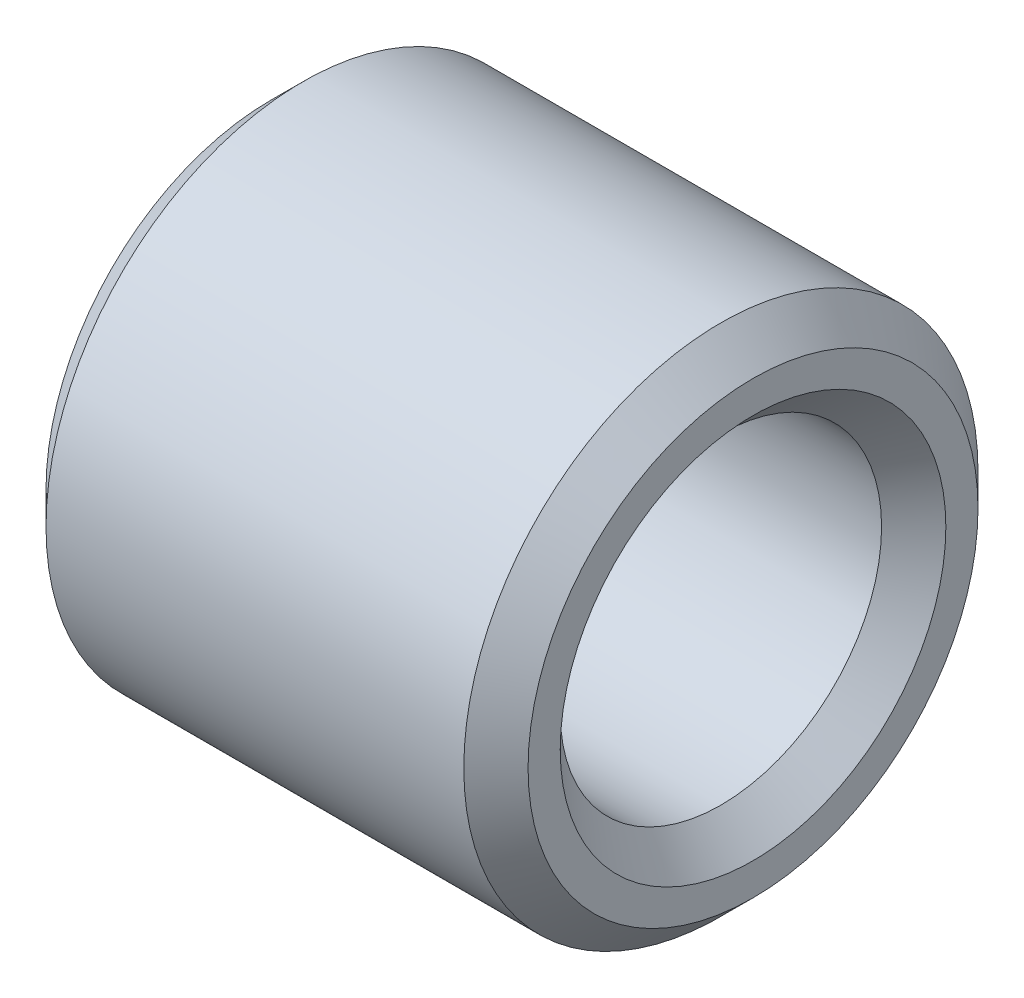
ISO-10303-21;
HEADER;
FILE_DESCRIPTION(('STEP AP214'),'2;1');
FILE_NAME('part.step','',(''),(''),'','','');
FILE_SCHEMA(('AUTOMOTIVE_DESIGN { 1 0 10303 214 1 1 1 1 }'));
ENDSEC;
DATA;
#1=APPLICATION_CONTEXT('core data for automotive mechanical design processes');
#2=APPLICATION_PROTOCOL_DEFINITION('international standard','automotive_design',2000,#1);
#3=PRODUCT_CONTEXT('',#1,'mechanical');
#4=PRODUCT('Part','Part','',(#3));
#5=PRODUCT_RELATED_PRODUCT_CATEGORY('part','',(#4));
#6=PRODUCT_DEFINITION_FORMATION('','',#4);
#7=PRODUCT_DEFINITION_CONTEXT('part definition',#1,'design');
#8=PRODUCT_DEFINITION('design','',#6,#7);
#9=PRODUCT_DEFINITION_SHAPE('','',#8);
#10=(LENGTH_UNIT() NAMED_UNIT(*) SI_UNIT(.MILLI.,.METRE.));
#11=(NAMED_UNIT(*) PLANE_ANGLE_UNIT() SI_UNIT($,.RADIAN.));
#12=(NAMED_UNIT(*) SI_UNIT($,.STERADIAN.) SOLID_ANGLE_UNIT());
#13=UNCERTAINTY_MEASURE_WITH_UNIT(LENGTH_MEASURE(1.E-05),#10,'distance_accuracy_value','');
#14=(GEOMETRIC_REPRESENTATION_CONTEXT(3) GLOBAL_UNCERTAINTY_ASSIGNED_CONTEXT((#13)) GLOBAL_UNIT_ASSIGNED_CONTEXT((#10,
#11,#12)) REPRESENTATION_CONTEXT('',''));
#15=CARTESIAN_POINT('',(0.,0.,0.));
#16=DIRECTION('',(0.,0.,1.));
#17=DIRECTION('',(1.,0.,0.));
#18=AXIS2_PLACEMENT_3D('',#15,#16,#17);
#19=CARTESIAN_POINT('',(7.5,0.,0.));
#20=DIRECTION('',(1.,0.,0.));
#21=DIRECTION('',(0.,0.,-1.));
#22=AXIS2_PLACEMENT_3D('',#19,#20,#21);
#23=PLANE('',#22);
#24=CARTESIAN_POINT('',(7.5,0.,0.));
#25=DIRECTION('',(1.,0.,0.));
#26=DIRECTION('',(0.,0.,-1.));
#27=AXIS2_PLACEMENT_3D('',#24,#25,#26);
#28=CIRCLE('',#27,3.00000000000001);
#29=CARTESIAN_POINT('',(7.5,0.,-3.00000000000001));
#30=VERTEX_POINT('',#29);
#31=EDGE_CURVE('E10',#30,#30,#28,.F.);
#32=ORIENTED_EDGE('',*,*,#31,.T.);
#33=EDGE_LOOP('',(#32));
#34=FACE_BOUND('',#33,.T.);
#35=CARTESIAN_POINT('',(7.5,0.,0.));
#36=DIRECTION('',(1.,0.,0.));
#37=DIRECTION('',(0.,0.,-1.));
#38=AXIS2_PLACEMENT_3D('',#35,#36,#37);
#39=CIRCLE('',#38,3.5);
#40=CARTESIAN_POINT('',(7.5,0.,-3.5));
#41=VERTEX_POINT('',#40);
#42=EDGE_CURVE('E48',#41,#41,#39,.T.);
#43=ORIENTED_EDGE('',*,*,#42,.T.);
#44=EDGE_LOOP('',(#43));
#45=FACE_BOUND('',#44,.T.);
#46=ADVANCED_FACE('F39',(#34,#45),#23,.T.);
#47=CARTESIAN_POINT('',(0.,0.,0.));
#48=DIRECTION('',(1.,0.,0.));
#49=DIRECTION('',(0.,0.,-1.));
#50=AXIS2_PLACEMENT_3D('',#47,#48,#49);
#51=PLANE('',#50);
#52=CARTESIAN_POINT('',(0.,0.,0.));
#53=DIRECTION('',(1.,0.,0.));
#54=DIRECTION('',(0.,0.,-1.));
#55=AXIS2_PLACEMENT_3D('',#52,#53,#54);
#56=CIRCLE('',#55,3.5);
#57=CARTESIAN_POINT('',(0.,0.,-3.5));
#58=VERTEX_POINT('',#57);
#59=EDGE_CURVE('E64',#58,#58,#56,.F.);
#60=ORIENTED_EDGE('',*,*,#59,.T.);
#61=EDGE_LOOP('',(#60));
#62=FACE_BOUND('',#61,.T.);
#63=CARTESIAN_POINT('',(0.,0.,0.));
#64=DIRECTION('',(1.,0.,0.));
#65=DIRECTION('',(0.,0.,-1.));
#66=AXIS2_PLACEMENT_3D('',#63,#64,#65);
#67=CIRCLE('',#66,3.);
#68=CARTESIAN_POINT('',(0.,0.,-3.));
#69=VERTEX_POINT('',#68);
#70=EDGE_CURVE('E68',#69,#69,#67,.T.);
#71=ORIENTED_EDGE('',*,*,#70,.T.);
#72=EDGE_LOOP('',(#71));
#73=FACE_BOUND('',#72,.T.);
#74=ADVANCED_FACE('F92',(#62,#73),#51,.F.);
#75=CARTESIAN_POINT('',(7.5,0.,0.));
#76=DIRECTION('',(-1.,0.,0.));
#77=DIRECTION('',(0.,0.,1.));
#78=AXIS2_PLACEMENT_3D('',#75,#76,#77);
#79=CYLINDRICAL_SURFACE('',#78,4.);
#80=CARTESIAN_POINT('',(0.500000000000001,0.,0.));
#81=DIRECTION('',(1.,0.,0.));
#82=DIRECTION('',(0.,0.,-1.));
#83=AXIS2_PLACEMENT_3D('',#80,#81,#82);
#84=CIRCLE('',#83,4.);
#85=CARTESIAN_POINT('',(0.500000000000001,0.,-4.));
#86=VERTEX_POINT('',#85);
#87=EDGE_CURVE('E72',#86,#86,#84,.T.);
#88=ORIENTED_EDGE('',*,*,#87,.T.);
#89=EDGE_LOOP('',(#88));
#90=FACE_BOUND('',#89,.T.);
#91=CARTESIAN_POINT('',(7.,0.,0.));
#92=DIRECTION('',(1.,0.,0.));
#93=DIRECTION('',(0.,0.,-1.));
#94=AXIS2_PLACEMENT_3D('',#91,#92,#93);
#95=CIRCLE('',#94,4.);
#96=CARTESIAN_POINT('',(7.,0.,-4.));
#97=VERTEX_POINT('',#96);
#98=EDGE_CURVE('E76',#97,#97,#95,.F.);
#99=ORIENTED_EDGE('',*,*,#98,.T.);
#100=EDGE_LOOP('',(#99));
#101=FACE_BOUND('',#100,.T.);
#102=ADVANCED_FACE('F81',(#90,#101),#79,.T.);
#103=CARTESIAN_POINT('',(7.5,0.,0.));
#104=DIRECTION('',(-1.,0.,0.));
#105=DIRECTION('',(0.,0.,1.));
#106=AXIS2_PLACEMENT_3D('',#103,#104,#105);
#107=CYLINDRICAL_SURFACE('',#106,2.5);
#108=CARTESIAN_POINT('',(0.500000000000002,0.,0.));
#109=DIRECTION('',(1.,0.,0.));
#110=DIRECTION('',(0.,0.,-1.));
#111=AXIS2_PLACEMENT_3D('',#108,#109,#110);
#112=CIRCLE('',#111,2.5);
#113=CARTESIAN_POINT('',(0.500000000000002,0.,-2.5));
#114=VERTEX_POINT('',#113);
#115=EDGE_CURVE('E53',#114,#114,#112,.F.);
#116=ORIENTED_EDGE('',*,*,#115,.T.);
#117=EDGE_LOOP('',(#116));
#118=FACE_BOUND('',#117,.T.);
#119=CARTESIAN_POINT('',(7.,0.,0.));
#120=DIRECTION('',(1.,0.,0.));
#121=DIRECTION('',(0.,0.,-1.));
#122=AXIS2_PLACEMENT_3D('',#119,#120,#121);
#123=CIRCLE('',#122,2.5);
#124=CARTESIAN_POINT('',(7.,0.,-2.5));
#125=VERTEX_POINT('',#124);
#126=EDGE_CURVE('E58',#125,#125,#123,.T.);
#127=ORIENTED_EDGE('',*,*,#126,.T.);
#128=EDGE_LOOP('',(#127));
#129=FACE_BOUND('',#128,.T.);
#130=ADVANCED_FACE('F100',(#118,#129),#107,.F.);
#131=CARTESIAN_POINT('',(0.500000000000001,0.,0.));
#132=DIRECTION('',(1.,0.,0.));
#133=DIRECTION('',(0.,0.,-1.));
#134=AXIS2_PLACEMENT_3D('',#131,#132,#133);
#135=CONICAL_SURFACE('',#134,4.,0.78539816339745);
#136=ORIENTED_EDGE('',*,*,#59,.F.);
#137=EDGE_LOOP('',(#136));
#138=FACE_BOUND('',#137,.T.);
#139=ORIENTED_EDGE('',*,*,#87,.F.);
#140=EDGE_LOOP('',(#139));
#141=FACE_BOUND('',#140,.T.);
#142=ADVANCED_FACE('F106',(#138,#141),#135,.T.);
#143=CARTESIAN_POINT('',(0.,0.,0.));
#144=DIRECTION('',(-1.,0.,0.));
#145=DIRECTION('',(0.,0.,1.));
#146=AXIS2_PLACEMENT_3D('',#143,#144,#145);
#147=CONICAL_SURFACE('',#146,3.,0.785398163397447);
#148=ORIENTED_EDGE('',*,*,#115,.F.);
#149=EDGE_LOOP('',(#148));
#150=FACE_BOUND('',#149,.T.);
#151=ORIENTED_EDGE('',*,*,#70,.F.);
#152=EDGE_LOOP('',(#151));
#153=FACE_BOUND('',#152,.T.);
#154=ADVANCED_FACE('F89',(#150,#153),#147,.F.);
#155=CARTESIAN_POINT('',(7.,0.,0.));
#156=DIRECTION('',(1.,0.,0.));
#157=DIRECTION('',(0.,0.,-1.));
#158=AXIS2_PLACEMENT_3D('',#155,#156,#157);
#159=CONICAL_SURFACE('',#158,2.5,0.78539816339745);
#160=ORIENTED_EDGE('',*,*,#31,.F.);
#161=EDGE_LOOP('',(#160));
#162=FACE_BOUND('',#161,.T.);
#163=ORIENTED_EDGE('',*,*,#126,.F.);
#164=EDGE_LOOP('',(#163));
#165=FACE_BOUND('',#164,.T.);
#166=ADVANCED_FACE('F85',(#162,#165),#159,.F.);
#167=CARTESIAN_POINT('',(7.5,0.,0.));
#168=DIRECTION('',(-1.,0.,0.));
#169=DIRECTION('',(0.,0.,1.));
#170=AXIS2_PLACEMENT_3D('',#167,#168,#169);
#171=CONICAL_SURFACE('',#170,3.5,0.785398163397447);
#172=ORIENTED_EDGE('',*,*,#98,.F.);
#173=EDGE_LOOP('',(#172));
#174=FACE_BOUND('',#173,.T.);
#175=ORIENTED_EDGE('',*,*,#42,.F.);
#176=EDGE_LOOP('',(#175));
#177=FACE_BOUND('',#176,.T.);
#178=ADVANCED_FACE('F42',(#174,#177),#171,.T.);
#179=CLOSED_SHELL('',(#46,#74,#102,#130,#142,#154,#166,#178));
#180=MANIFOLD_SOLID_BREP('B2',#179);
#181=ADVANCED_BREP_SHAPE_REPRESENTATION('',(#18,#180),#14);
#182=SHAPE_DEFINITION_REPRESENTATION(#9,#181);
ENDSEC;
END-ISO-10303-21;
